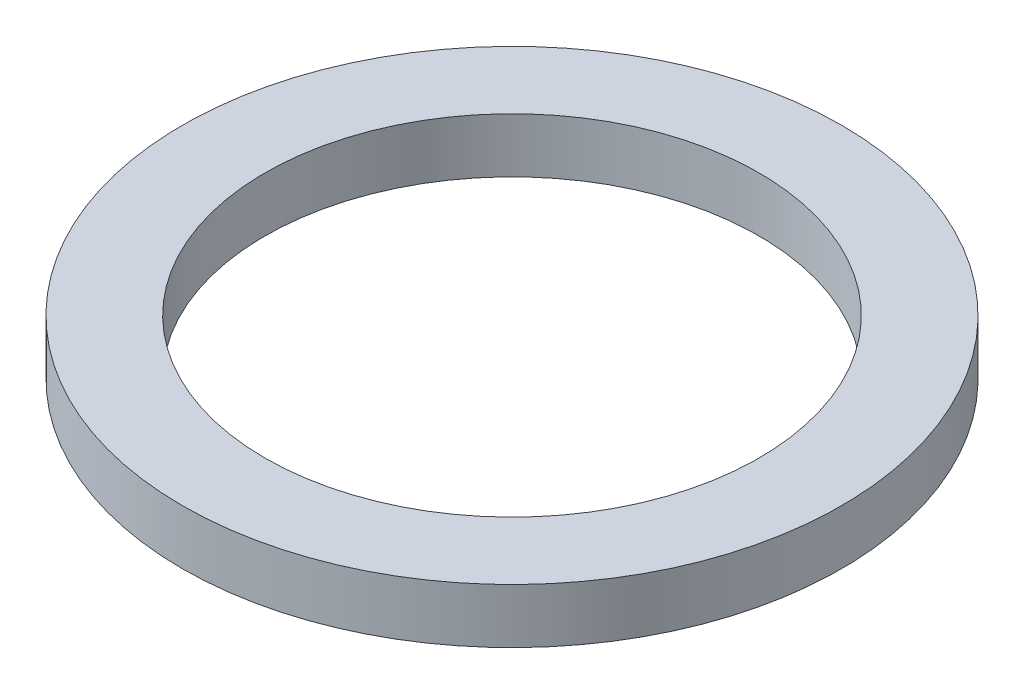
ISO-10303-21;
HEADER;
FILE_DESCRIPTION(('STEP AP214'),'2;1');
FILE_NAME('part.step','',(''),(''),'','','');
FILE_SCHEMA(('AUTOMOTIVE_DESIGN { 1 0 10303 214 1 1 1 1 }'));
ENDSEC;
DATA;
#1=APPLICATION_CONTEXT('core data for automotive mechanical design processes');
#2=APPLICATION_PROTOCOL_DEFINITION('international standard','automotive_design',2000,#1);
#3=PRODUCT_CONTEXT('',#1,'mechanical');
#4=PRODUCT('Part','Part','',(#3));
#5=PRODUCT_RELATED_PRODUCT_CATEGORY('part','',(#4));
#6=PRODUCT_DEFINITION_FORMATION('','',#4);
#7=PRODUCT_DEFINITION_CONTEXT('part definition',#1,'design');
#8=PRODUCT_DEFINITION('design','',#6,#7);
#9=PRODUCT_DEFINITION_SHAPE('','',#8);
#10=(LENGTH_UNIT() NAMED_UNIT(*) SI_UNIT(.MILLI.,.METRE.));
#11=(NAMED_UNIT(*) PLANE_ANGLE_UNIT() SI_UNIT($,.RADIAN.));
#12=(NAMED_UNIT(*) SI_UNIT($,.STERADIAN.) SOLID_ANGLE_UNIT());
#13=UNCERTAINTY_MEASURE_WITH_UNIT(LENGTH_MEASURE(1.E-05),#10,'distance_accuracy_value','');
#14=(GEOMETRIC_REPRESENTATION_CONTEXT(3) GLOBAL_UNCERTAINTY_ASSIGNED_CONTEXT((#13)) GLOBAL_UNIT_ASSIGNED_CONTEXT((#10,
#11,#12)) REPRESENTATION_CONTEXT('',''));
#15=CARTESIAN_POINT('',(0.,0.,0.));
#16=DIRECTION('',(0.,0.,1.));
#17=DIRECTION('',(1.,0.,0.));
#18=AXIS2_PLACEMENT_3D('',#15,#16,#17);
#19=CARTESIAN_POINT('',(0.,6.35,0.));
#20=DIRECTION('',(0.,1.,0.));
#21=DIRECTION('',(0.,0.,1.));
#22=AXIS2_PLACEMENT_3D('',#19,#20,#21);
#23=PLANE('',#22);
#24=CARTESIAN_POINT('',(0.,6.35,0.));
#25=DIRECTION('',(0.,1.,0.));
#26=DIRECTION('',(0.,0.,1.));
#27=AXIS2_PLACEMENT_3D('',#24,#25,#26);
#28=CIRCLE('',#27,38.2905);
#29=CARTESIAN_POINT('',(0.,6.35,38.2905));
#30=VERTEX_POINT('',#29);
#31=EDGE_CURVE('E10',#30,#30,#28,.T.);
#32=ORIENTED_EDGE('',*,*,#31,.T.);
#33=EDGE_LOOP('',(#32));
#34=FACE_BOUND('',#33,.T.);
#35=CARTESIAN_POINT('',(0.,6.35,0.));
#36=DIRECTION('',(0.,1.,0.));
#37=DIRECTION('',(0.,0.,1.));
#38=AXIS2_PLACEMENT_3D('',#35,#36,#37);
#39=CIRCLE('',#38,28.702);
#40=CARTESIAN_POINT('',(0.,6.35,28.702));
#41=VERTEX_POINT('',#40);
#42=EDGE_CURVE('E54',#41,#41,#39,.T.);
#43=ORIENTED_EDGE('',*,*,#42,.F.);
#44=EDGE_LOOP('',(#43));
#45=FACE_BOUND('',#44,.T.);
#46=ADVANCED_FACE('F41',(#34,#45),#23,.T.);
#47=CARTESIAN_POINT('',(0.,0.,0.));
#48=DIRECTION('',(0.,1.,0.));
#49=DIRECTION('',(0.,0.,1.));
#50=AXIS2_PLACEMENT_3D('',#47,#48,#49);
#51=PLANE('',#50);
#52=CARTESIAN_POINT('',(0.,0.,0.));
#53=DIRECTION('',(0.,1.,0.));
#54=DIRECTION('',(0.,0.,1.));
#55=AXIS2_PLACEMENT_3D('',#52,#53,#54);
#56=CIRCLE('',#55,38.2905);
#57=CARTESIAN_POINT('',(0.,0.,38.2905));
#58=VERTEX_POINT('',#57);
#59=EDGE_CURVE('E45',#58,#58,#56,.T.);
#60=ORIENTED_EDGE('',*,*,#59,.F.);
#61=EDGE_LOOP('',(#60));
#62=FACE_BOUND('',#61,.T.);
#63=CARTESIAN_POINT('',(0.,0.,0.));
#64=DIRECTION('',(0.,1.,0.));
#65=DIRECTION('',(0.,0.,1.));
#66=AXIS2_PLACEMENT_3D('',#63,#64,#65);
#67=CIRCLE('',#66,28.702);
#68=CARTESIAN_POINT('',(0.,0.,28.702));
#69=VERTEX_POINT('',#68);
#70=EDGE_CURVE('E56',#69,#69,#67,.T.);
#71=ORIENTED_EDGE('',*,*,#70,.T.);
#72=EDGE_LOOP('',(#71));
#73=FACE_BOUND('',#72,.T.);
#74=ADVANCED_FACE('F68',(#62,#73),#51,.F.);
#75=CARTESIAN_POINT('',(0.,6.35,0.));
#76=DIRECTION('',(0.,-1.,0.));
#77=DIRECTION('',(0.,0.,-1.));
#78=AXIS2_PLACEMENT_3D('',#75,#76,#77);
#79=CYLINDRICAL_SURFACE('',#78,38.2905);
#80=ORIENTED_EDGE('',*,*,#31,.F.);
#81=EDGE_LOOP('',(#80));
#82=FACE_BOUND('',#81,.T.);
#83=ORIENTED_EDGE('',*,*,#59,.T.);
#84=EDGE_LOOP('',(#83));
#85=FACE_BOUND('',#84,.T.);
#86=ADVANCED_FACE('F43',(#82,#85),#79,.T.);
#87=CARTESIAN_POINT('',(0.,6.35,0.));
#88=DIRECTION('',(0.,-1.,0.));
#89=DIRECTION('',(0.,0.,-1.));
#90=AXIS2_PLACEMENT_3D('',#87,#88,#89);
#91=CYLINDRICAL_SURFACE('',#90,28.702);
#92=ORIENTED_EDGE('',*,*,#42,.T.);
#93=EDGE_LOOP('',(#92));
#94=FACE_BOUND('',#93,.T.);
#95=ORIENTED_EDGE('',*,*,#70,.F.);
#96=EDGE_LOOP('',(#95));
#97=FACE_BOUND('',#96,.T.);
#98=ADVANCED_FACE('F64',(#94,#97),#91,.F.);
#99=CLOSED_SHELL('',(#46,#74,#86,#98));
#100=MANIFOLD_SOLID_BREP('B2',#99);
#101=ADVANCED_BREP_SHAPE_REPRESENTATION('',(#18,#100),#14);
#102=SHAPE_DEFINITION_REPRESENTATION(#9,#101);
ENDSEC;
END-ISO-10303-21;
